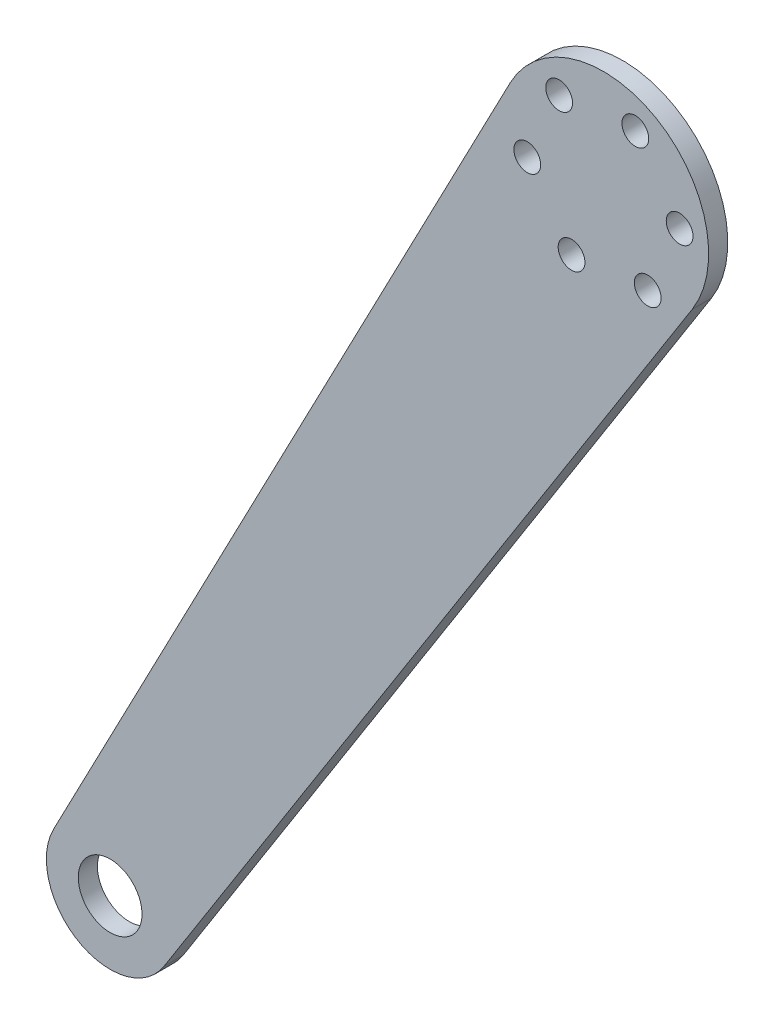
ISO-10303-21;
HEADER;
FILE_DESCRIPTION(('STEP AP214'),'2;1');
FILE_NAME('part.step','',(''),(''),'','','');
FILE_SCHEMA(('AUTOMOTIVE_DESIGN { 1 0 10303 214 1 1 1 1 }'));
ENDSEC;
DATA;
#1=APPLICATION_CONTEXT('core data for automotive mechanical design processes');
#2=APPLICATION_PROTOCOL_DEFINITION('international standard','automotive_design',2000,#1);
#3=PRODUCT_CONTEXT('',#1,'mechanical');
#4=PRODUCT('Part','Part','',(#3));
#5=PRODUCT_RELATED_PRODUCT_CATEGORY('part','',(#4));
#6=PRODUCT_DEFINITION_FORMATION('','',#4);
#7=PRODUCT_DEFINITION_CONTEXT('part definition',#1,'design');
#8=PRODUCT_DEFINITION('design','',#6,#7);
#9=PRODUCT_DEFINITION_SHAPE('','',#8);
#10=(LENGTH_UNIT() NAMED_UNIT(*) SI_UNIT(.MILLI.,.METRE.));
#11=(NAMED_UNIT(*) PLANE_ANGLE_UNIT() SI_UNIT($,.RADIAN.));
#12=(NAMED_UNIT(*) SI_UNIT($,.STERADIAN.) SOLID_ANGLE_UNIT());
#13=UNCERTAINTY_MEASURE_WITH_UNIT(LENGTH_MEASURE(1.E-05),#10,'distance_accuracy_value','');
#14=(GEOMETRIC_REPRESENTATION_CONTEXT(3) GLOBAL_UNCERTAINTY_ASSIGNED_CONTEXT((#13)) GLOBAL_UNIT_ASSIGNED_CONTEXT((#10,
#11,#12)) REPRESENTATION_CONTEXT('',''));
#15=CARTESIAN_POINT('',(0.,0.,0.));
#16=DIRECTION('',(0.,0.,1.));
#17=DIRECTION('',(1.,0.,0.));
#18=AXIS2_PLACEMENT_3D('',#15,#16,#17);
#19=CARTESIAN_POINT('',(-74.391553652002,-84.5862183341336,37.0567284098367));
#20=DIRECTION('',(0.,0.,-1.));
#21=DIRECTION('',(-1.,0.,0.));
#22=AXIS2_PLACEMENT_3D('',#19,#20,#21);
#23=PLANE('',#22);
#24=CARTESIAN_POINT('',(-2.02418145154922,38.6653338466076,37.0567284098367));
#25=DIRECTION('',(0.,0.,-1.));
#26=DIRECTION('',(-1.,0.,0.));
#27=AXIS2_PLACEMENT_3D('',#24,#25,#26);
#28=CIRCLE('',#27,2.1);
#29=CARTESIAN_POINT('',(-4.12418145154922,38.6653338466076,37.0567284098367));
#30=VERTEX_POINT('',#29);
#31=EDGE_CURVE('E148',#30,#30,#28,.T.);
#32=ORIENTED_EDGE('',*,*,#31,.F.);
#33=EDGE_LOOP('',(#32));
#34=FACE_BOUND('',#33,.T.);
#35=CARTESIAN_POINT('',(-3.96960396064169,59.3586982724383,37.0567284098367));
#36=DIRECTION('',(0.,0.,-1.));
#37=DIRECTION('',(-1.,0.,0.));
#38=AXIS2_PLACEMENT_3D('',#35,#36,#37);
#39=CIRCLE('',#38,2.1);
#40=CARTESIAN_POINT('',(-6.06960396064169,59.3586982724383,37.0567284098367));
#41=VERTEX_POINT('',#40);
#42=EDGE_CURVE('E136',#41,#41,#39,.T.);
#43=ORIENTED_EDGE('',*,*,#42,.F.);
#44=EDGE_LOOP('',(#43));
#45=FACE_BOUND('',#44,.T.);
#46=CARTESIAN_POINT('',(-74.391553652002,-84.5862183341336,37.0567284098367));
#47=DIRECTION('',(0.,0.,-1.));
#48=DIRECTION('',(-1.,0.,0.));
#49=AXIS2_PLACEMENT_3D('',#46,#47,#48);
#50=CIRCLE('',#49,5.00000000000001);
#51=CARTESIAN_POINT('',(-79.391553652002,-84.5862183341336,37.0567284098367));
#52=VERTEX_POINT('',#51);
#53=EDGE_CURVE('E124',#52,#52,#50,.T.);
#54=ORIENTED_EDGE('',*,*,#53,.F.);
#55=EDGE_LOOP('',(#54));
#56=FACE_BOUND('',#55,.T.);
#57=CARTESIAN_POINT('',(-74.391553652002,-84.5862183341336,37.0567284098367));
#58=DIRECTION('',(0.,0.,-1.));
#59=DIRECTION('',(-1.,0.,0.));
#60=AXIS2_PLACEMENT_3D('',#57,#58,#59);
#61=CIRCLE('',#60,10.);
#62=CARTESIAN_POINT('',(-65.946121215485,-89.9410919050247,37.0567284098367));
#63=VERTEX_POINT('',#62);
#64=CARTESIAN_POINT('',(-83.2563315297769,-79.9585068935064,37.0567284098367));
#65=VERTEX_POINT('',#64);
#66=EDGE_CURVE('E94',#63,#65,#61,.T.);
#67=ORIENTED_EDGE('',*,*,#66,.T.);
#68=DIRECTION('',(0.462771144062719,0.886477787777495,0.));
#69=VECTOR('',#68,1.);
#70=CARTESIAN_POINT('',(-83.2563315297769,-79.9585068935064,37.0567284098367));
#71=LINE('',#70,#69);
#72=CARTESIAN_POINT('',(-11.6501164435668,57.2093350412102,37.0567284098367));
#73=VERTEX_POINT('',#72);
#74=EDGE_CURVE('E89',#65,#73,#71,.T.);
#75=ORIENTED_EDGE('',*,*,#74,.T.);
#76=CARTESIAN_POINT('',(2.97676705476191,49.5736111641754,37.0567284098367));
#77=DIRECTION('',(0.,0.,-1.));
#78=DIRECTION('',(-1.,0.,0.));
#79=AXIS2_PLACEMENT_3D('',#76,#77,#78);
#80=CIRCLE('',#79,16.5);
#81=CARTESIAN_POINT('',(16.9117305750148,40.7380697722051,37.0567284098367));
#82=VERTEX_POINT('',#81);
#83=EDGE_CURVE('E92',#73,#82,#80,.T.);
#84=ORIENTED_EDGE('',*,*,#83,.T.);
#85=DIRECTION('',(-0.535487357089108,-0.844543243651693,0.));
#86=VECTOR('',#85,1.);
#87=CARTESIAN_POINT('',(16.9117305750148,40.7380697722051,37.0567284098367));
#88=LINE('',#87,#86);
#89=EDGE_CURVE('E59',#82,#63,#88,.T.);
#90=ORIENTED_EDGE('',*,*,#89,.T.);
#91=EDGE_LOOP('',(#67,#75,#84,#90));
#92=FACE_BOUND('',#91,.T.);
#93=CARTESIAN_POINT('',(14.924086576466,50.696801373494,37.0567284098367));
#94=DIRECTION('',(0.,0.,-1.));
#95=DIRECTION('',(-1.,0.,0.));
#96=AXIS2_PLACEMENT_3D('',#93,#94,#95);
#97=CIRCLE('',#96,2.1);
#98=CARTESIAN_POINT('',(12.824086576466,50.696801373494,37.0567284098367));
#99=VERTEX_POINT('',#98);
#100=EDGE_CURVE('E109',#99,#99,#97,.T.);
#101=ORIENTED_EDGE('',*,*,#100,.F.);
#102=EDGE_LOOP('',(#101));
#103=FACE_BOUND('',#102,.T.);
#104=CARTESIAN_POINT('',(7.97771556106237,60.4818884817569,37.0567284098367));
#105=DIRECTION('',(0.,0.,-1.));
#106=DIRECTION('',(-1.,0.,0.));
#107=AXIS2_PLACEMENT_3D('',#104,#105,#106);
#108=CIRCLE('',#107,2.1);
#109=CARTESIAN_POINT('',(5.87771556106237,60.4818884817569,37.0567284098367));
#110=VERTEX_POINT('',#109);
#111=EDGE_CURVE('E130',#110,#110,#108,.T.);
#112=ORIENTED_EDGE('',*,*,#111,.F.);
#113=EDGE_LOOP('',(#112));
#114=FACE_BOUND('',#113,.T.);
#115=CARTESIAN_POINT('',(-8.97055246695019,48.4504209548757,37.0567284098367));
#116=DIRECTION('',(0.,0.,-1.));
#117=DIRECTION('',(-1.,0.,0.));
#118=AXIS2_PLACEMENT_3D('',#115,#116,#117);
#119=CIRCLE('',#118,2.1);
#120=CARTESIAN_POINT('',(-11.0705524669502,48.4504209548757,37.0567284098367));
#121=VERTEX_POINT('',#120);
#122=EDGE_CURVE('E142',#121,#121,#119,.T.);
#123=ORIENTED_EDGE('',*,*,#122,.F.);
#124=EDGE_LOOP('',(#123));
#125=FACE_BOUND('',#124,.T.);
#126=CARTESIAN_POINT('',(9.92313807016551,39.7885240559125,37.0567284098367));
#127=DIRECTION('',(0.,0.,-1.));
#128=DIRECTION('',(-1.,0.,0.));
#129=AXIS2_PLACEMENT_3D('',#126,#127,#128);
#130=CIRCLE('',#129,2.1);
#131=CARTESIAN_POINT('',(7.82313807016552,39.7885240559125,37.0567284098367));
#132=VERTEX_POINT('',#131);
#133=EDGE_CURVE('E154',#132,#132,#130,.T.);
#134=ORIENTED_EDGE('',*,*,#133,.F.);
#135=EDGE_LOOP('',(#134));
#136=FACE_BOUND('',#135,.T.);
#137=ADVANCED_FACE('F42',(#34,#45,#56,#92,#103,#114,#125,#136),#23,.T.);
#138=CARTESIAN_POINT('',(-74.391553652002,-84.5862183341336,40.0567284098367));
#139=DIRECTION('',(0.,0.,-1.));
#140=DIRECTION('',(-1.,0.,0.));
#141=AXIS2_PLACEMENT_3D('',#138,#139,#140);
#142=PLANE('',#141);
#143=CARTESIAN_POINT('',(-74.391553652002,-84.5862183341336,40.0567284098367));
#144=DIRECTION('',(0.,0.,-1.));
#145=DIRECTION('',(-1.,0.,0.));
#146=AXIS2_PLACEMENT_3D('',#143,#144,#145);
#147=CIRCLE('',#146,10.);
#148=CARTESIAN_POINT('',(-65.946121215485,-89.9410919050247,40.0567284098367));
#149=VERTEX_POINT('',#148);
#150=CARTESIAN_POINT('',(-83.2563315297769,-79.9585068935064,40.0567284098367));
#151=VERTEX_POINT('',#150);
#152=EDGE_CURVE('E106',#149,#151,#147,.T.);
#153=ORIENTED_EDGE('',*,*,#152,.F.);
#154=DIRECTION('',(-0.535487357089108,-0.844543243651693,0.));
#155=VECTOR('',#154,1.);
#156=CARTESIAN_POINT('',(16.9117305750148,40.7380697722051,40.0567284098367));
#157=LINE('',#156,#155);
#158=CARTESIAN_POINT('',(16.9117305750148,40.7380697722051,40.0567284098367));
#159=VERTEX_POINT('',#158);
#160=EDGE_CURVE('E82',#159,#149,#157,.T.);
#161=ORIENTED_EDGE('',*,*,#160,.F.);
#162=CARTESIAN_POINT('',(2.97676705476191,49.5736111641754,40.0567284098367));
#163=DIRECTION('',(0.,0.,-1.));
#164=DIRECTION('',(-1.,0.,0.));
#165=AXIS2_PLACEMENT_3D('',#162,#163,#164);
#166=CIRCLE('',#165,16.5);
#167=CARTESIAN_POINT('',(-11.6501164435668,57.2093350412102,40.0567284098367));
#168=VERTEX_POINT('',#167);
#169=EDGE_CURVE('E76',#168,#159,#166,.T.);
#170=ORIENTED_EDGE('',*,*,#169,.F.);
#171=DIRECTION('',(0.462771144062719,0.886477787777495,0.));
#172=VECTOR('',#171,1.);
#173=CARTESIAN_POINT('',(-83.2563315297769,-79.9585068935064,40.0567284098367));
#174=LINE('',#173,#172);
#175=EDGE_CURVE('E98',#151,#168,#174,.T.);
#176=ORIENTED_EDGE('',*,*,#175,.F.);
#177=EDGE_LOOP('',(#153,#161,#170,#176));
#178=FACE_BOUND('',#177,.T.);
#179=CARTESIAN_POINT('',(14.924086576466,50.696801373494,40.0567284098367));
#180=DIRECTION('',(0.,0.,-1.));
#181=DIRECTION('',(-1.,0.,0.));
#182=AXIS2_PLACEMENT_3D('',#179,#180,#181);
#183=CIRCLE('',#182,2.1);
#184=CARTESIAN_POINT('',(12.824086576466,50.696801373494,40.0567284098367));
#185=VERTEX_POINT('',#184);
#186=EDGE_CURVE('E121',#185,#185,#183,.T.);
#187=ORIENTED_EDGE('',*,*,#186,.T.);
#188=EDGE_LOOP('',(#187));
#189=FACE_BOUND('',#188,.T.);
#190=CARTESIAN_POINT('',(-74.391553652002,-84.5862183341336,40.0567284098367));
#191=DIRECTION('',(0.,0.,-1.));
#192=DIRECTION('',(-1.,0.,0.));
#193=AXIS2_PLACEMENT_3D('',#190,#191,#192);
#194=CIRCLE('',#193,5.00000000000001);
#195=CARTESIAN_POINT('',(-79.391553652002,-84.5862183341336,40.0567284098367));
#196=VERTEX_POINT('',#195);
#197=EDGE_CURVE('E127',#196,#196,#194,.T.);
#198=ORIENTED_EDGE('',*,*,#197,.T.);
#199=EDGE_LOOP('',(#198));
#200=FACE_BOUND('',#199,.T.);
#201=CARTESIAN_POINT('',(7.97771556106237,60.4818884817569,40.0567284098367));
#202=DIRECTION('',(0.,0.,-1.));
#203=DIRECTION('',(-1.,0.,0.));
#204=AXIS2_PLACEMENT_3D('',#201,#202,#203);
#205=CIRCLE('',#204,2.1);
#206=CARTESIAN_POINT('',(5.87771556106237,60.4818884817569,40.0567284098367));
#207=VERTEX_POINT('',#206);
#208=EDGE_CURVE('E133',#207,#207,#205,.T.);
#209=ORIENTED_EDGE('',*,*,#208,.T.);
#210=EDGE_LOOP('',(#209));
#211=FACE_BOUND('',#210,.T.);
#212=CARTESIAN_POINT('',(-3.96960396064169,59.3586982724383,40.0567284098367));
#213=DIRECTION('',(0.,0.,-1.));
#214=DIRECTION('',(-1.,0.,0.));
#215=AXIS2_PLACEMENT_3D('',#212,#213,#214);
#216=CIRCLE('',#215,2.1);
#217=CARTESIAN_POINT('',(-6.06960396064169,59.3586982724383,40.0567284098367));
#218=VERTEX_POINT('',#217);
#219=EDGE_CURVE('E139',#218,#218,#216,.T.);
#220=ORIENTED_EDGE('',*,*,#219,.T.);
#221=EDGE_LOOP('',(#220));
#222=FACE_BOUND('',#221,.T.);
#223=CARTESIAN_POINT('',(-8.97055246695019,48.4504209548757,40.0567284098367));
#224=DIRECTION('',(0.,0.,-1.));
#225=DIRECTION('',(-1.,0.,0.));
#226=AXIS2_PLACEMENT_3D('',#223,#224,#225);
#227=CIRCLE('',#226,2.1);
#228=CARTESIAN_POINT('',(-11.0705524669502,48.4504209548757,40.0567284098367));
#229=VERTEX_POINT('',#228);
#230=EDGE_CURVE('E145',#229,#229,#227,.T.);
#231=ORIENTED_EDGE('',*,*,#230,.T.);
#232=EDGE_LOOP('',(#231));
#233=FACE_BOUND('',#232,.T.);
#234=CARTESIAN_POINT('',(-2.02418145154922,38.6653338466076,40.0567284098367));
#235=DIRECTION('',(0.,0.,-1.));
#236=DIRECTION('',(-1.,0.,0.));
#237=AXIS2_PLACEMENT_3D('',#234,#235,#236);
#238=CIRCLE('',#237,2.1);
#239=CARTESIAN_POINT('',(-4.12418145154922,38.6653338466076,40.0567284098367));
#240=VERTEX_POINT('',#239);
#241=EDGE_CURVE('E151',#240,#240,#238,.T.);
#242=ORIENTED_EDGE('',*,*,#241,.T.);
#243=EDGE_LOOP('',(#242));
#244=FACE_BOUND('',#243,.T.);
#245=CARTESIAN_POINT('',(9.92313807016551,39.7885240559125,40.0567284098367));
#246=DIRECTION('',(0.,0.,-1.));
#247=DIRECTION('',(-1.,0.,0.));
#248=AXIS2_PLACEMENT_3D('',#245,#246,#247);
#249=CIRCLE('',#248,2.1);
#250=CARTESIAN_POINT('',(7.82313807016552,39.7885240559125,40.0567284098367));
#251=VERTEX_POINT('',#250);
#252=EDGE_CURVE('E157',#251,#251,#249,.T.);
#253=ORIENTED_EDGE('',*,*,#252,.T.);
#254=EDGE_LOOP('',(#253));
#255=FACE_BOUND('',#254,.T.);
#256=ADVANCED_FACE('F117',(#178,#189,#200,#211,#222,#233,#244,#255),#142,.F.);
#257=CARTESIAN_POINT('',(-74.391553652002,-84.5862183341336,37.0567284098367));
#258=DIRECTION('',(0.,0.,1.));
#259=DIRECTION('',(1.,0.,0.));
#260=AXIS2_PLACEMENT_3D('',#257,#258,#259);
#261=CYLINDRICAL_SURFACE('',#260,10.);
#262=ORIENTED_EDGE('',*,*,#152,.T.);
#263=DIRECTION('',(0.,0.,1.));
#264=VECTOR('',#263,1.);
#265=CARTESIAN_POINT('',(-83.2563315297769,-79.9585068935064,37.0567284098367));
#266=LINE('',#265,#264);
#267=EDGE_CURVE('E11',#65,#151,#266,.T.);
#268=ORIENTED_EDGE('',*,*,#267,.F.);
#269=ORIENTED_EDGE('',*,*,#66,.F.);
#270=DIRECTION('',(0.,0.,1.));
#271=VECTOR('',#270,1.);
#272=CARTESIAN_POINT('',(-65.946121215485,-89.9410919050247,37.0567284098367));
#273=LINE('',#272,#271);
#274=EDGE_CURVE('E102',#63,#149,#273,.T.);
#275=ORIENTED_EDGE('',*,*,#274,.T.);
#276=EDGE_LOOP('',(#262,#268,#269,#275));
#277=FACE_BOUND('',#276,.T.);
#278=ADVANCED_FACE('F44',(#277),#261,.T.);
#279=CARTESIAN_POINT('',(-83.2563315297769,-79.9585068935064,37.0567284098367));
#280=DIRECTION('',(0.886477787777495,-0.462771144062719,0.));
#281=DIRECTION('',(0.46277114406272,0.886477787777495,0.));
#282=AXIS2_PLACEMENT_3D('',#279,#280,#281);
#283=PLANE('',#282);
#284=ORIENTED_EDGE('',*,*,#175,.T.);
#285=DIRECTION('',(0.,0.,1.));
#286=VECTOR('',#285,1.);
#287=CARTESIAN_POINT('',(-11.6501164435668,57.2093350412102,37.0567284098367));
#288=LINE('',#287,#286);
#289=EDGE_CURVE('E51',#73,#168,#288,.T.);
#290=ORIENTED_EDGE('',*,*,#289,.F.);
#291=ORIENTED_EDGE('',*,*,#74,.F.);
#292=ORIENTED_EDGE('',*,*,#267,.T.);
#293=EDGE_LOOP('',(#284,#290,#291,#292));
#294=FACE_BOUND('',#293,.T.);
#295=ADVANCED_FACE('F97',(#294),#283,.F.);
#296=CARTESIAN_POINT('',(2.97676705476191,49.5736111641754,37.0567284098367));
#297=DIRECTION('',(0.,0.,1.));
#298=DIRECTION('',(1.,0.,0.));
#299=AXIS2_PLACEMENT_3D('',#296,#297,#298);
#300=CYLINDRICAL_SURFACE('',#299,16.5);
#301=ORIENTED_EDGE('',*,*,#169,.T.);
#302=DIRECTION('',(0.,0.,1.));
#303=VECTOR('',#302,1.);
#304=CARTESIAN_POINT('',(16.9117305750148,40.7380697722051,37.0567284098367));
#305=LINE('',#304,#303);
#306=EDGE_CURVE('E99',#82,#159,#305,.T.);
#307=ORIENTED_EDGE('',*,*,#306,.F.);
#308=ORIENTED_EDGE('',*,*,#83,.F.);
#309=ORIENTED_EDGE('',*,*,#289,.T.);
#310=EDGE_LOOP('',(#301,#307,#308,#309));
#311=FACE_BOUND('',#310,.T.);
#312=ADVANCED_FACE('F100',(#311),#300,.T.);
#313=CARTESIAN_POINT('',(16.9117305750148,40.7380697722051,37.0567284098367));
#314=DIRECTION('',(-0.844543243651693,0.535487357089108,0.));
#315=DIRECTION('',(-0.535487357089108,-0.844543243651693,0.));
#316=AXIS2_PLACEMENT_3D('',#313,#314,#315);
#317=PLANE('',#316);
#318=ORIENTED_EDGE('',*,*,#160,.T.);
#319=ORIENTED_EDGE('',*,*,#274,.F.);
#320=ORIENTED_EDGE('',*,*,#89,.F.);
#321=ORIENTED_EDGE('',*,*,#306,.T.);
#322=EDGE_LOOP('',(#318,#319,#320,#321));
#323=FACE_BOUND('',#322,.T.);
#324=ADVANCED_FACE('F114',(#323),#317,.F.);
#325=CARTESIAN_POINT('',(14.924086576466,50.696801373494,37.0567284098367));
#326=DIRECTION('',(0.,0.,1.));
#327=DIRECTION('',(1.,0.,0.));
#328=AXIS2_PLACEMENT_3D('',#325,#326,#327);
#329=CYLINDRICAL_SURFACE('',#328,2.1);
#330=ORIENTED_EDGE('',*,*,#100,.T.);
#331=EDGE_LOOP('',(#330));
#332=FACE_BOUND('',#331,.T.);
#333=ORIENTED_EDGE('',*,*,#186,.F.);
#334=EDGE_LOOP('',(#333));
#335=FACE_BOUND('',#334,.T.);
#336=ADVANCED_FACE('F176',(#332,#335),#329,.F.);
#337=CARTESIAN_POINT('',(-74.391553652002,-84.5862183341336,37.0567284098367));
#338=DIRECTION('',(0.,0.,1.));
#339=DIRECTION('',(1.,0.,0.));
#340=AXIS2_PLACEMENT_3D('',#337,#338,#339);
#341=CYLINDRICAL_SURFACE('',#340,5.00000000000001);
#342=ORIENTED_EDGE('',*,*,#53,.T.);
#343=EDGE_LOOP('',(#342));
#344=FACE_BOUND('',#343,.T.);
#345=ORIENTED_EDGE('',*,*,#197,.F.);
#346=EDGE_LOOP('',(#345));
#347=FACE_BOUND('',#346,.T.);
#348=ADVANCED_FACE('F205',(#344,#347),#341,.F.);
#349=CARTESIAN_POINT('',(7.97771556106237,60.4818884817569,37.0567284098367));
#350=DIRECTION('',(0.,0.,1.));
#351=DIRECTION('',(1.,0.,0.));
#352=AXIS2_PLACEMENT_3D('',#349,#350,#351);
#353=CYLINDRICAL_SURFACE('',#352,2.1);
#354=ORIENTED_EDGE('',*,*,#111,.T.);
#355=EDGE_LOOP('',(#354));
#356=FACE_BOUND('',#355,.T.);
#357=ORIENTED_EDGE('',*,*,#208,.F.);
#358=EDGE_LOOP('',(#357));
#359=FACE_BOUND('',#358,.T.);
#360=ADVANCED_FACE('F226',(#356,#359),#353,.F.);
#361=CARTESIAN_POINT('',(-3.96960396064169,59.3586982724383,37.0567284098367));
#362=DIRECTION('',(0.,0.,1.));
#363=DIRECTION('',(1.,0.,0.));
#364=AXIS2_PLACEMENT_3D('',#361,#362,#363);
#365=CYLINDRICAL_SURFACE('',#364,2.1);
#366=ORIENTED_EDGE('',*,*,#42,.T.);
#367=EDGE_LOOP('',(#366));
#368=FACE_BOUND('',#367,.T.);
#369=ORIENTED_EDGE('',*,*,#219,.F.);
#370=EDGE_LOOP('',(#369));
#371=FACE_BOUND('',#370,.T.);
#372=ADVANCED_FACE('F230',(#368,#371),#365,.F.);
#373=CARTESIAN_POINT('',(-8.97055246695019,48.4504209548757,37.0567284098367));
#374=DIRECTION('',(0.,0.,1.));
#375=DIRECTION('',(1.,0.,0.));
#376=AXIS2_PLACEMENT_3D('',#373,#374,#375);
#377=CYLINDRICAL_SURFACE('',#376,2.1);
#378=ORIENTED_EDGE('',*,*,#122,.T.);
#379=EDGE_LOOP('',(#378));
#380=FACE_BOUND('',#379,.T.);
#381=ORIENTED_EDGE('',*,*,#230,.F.);
#382=EDGE_LOOP('',(#381));
#383=FACE_BOUND('',#382,.T.);
#384=ADVANCED_FACE('F239',(#380,#383),#377,.F.);
#385=CARTESIAN_POINT('',(-2.02418145154922,38.6653338466076,37.0567284098367));
#386=DIRECTION('',(0.,0.,1.));
#387=DIRECTION('',(1.,0.,0.));
#388=AXIS2_PLACEMENT_3D('',#385,#386,#387);
#389=CYLINDRICAL_SURFACE('',#388,2.1);
#390=ORIENTED_EDGE('',*,*,#31,.T.);
#391=EDGE_LOOP('',(#390));
#392=FACE_BOUND('',#391,.T.);
#393=ORIENTED_EDGE('',*,*,#241,.F.);
#394=EDGE_LOOP('',(#393));
#395=FACE_BOUND('',#394,.T.);
#396=ADVANCED_FACE('F211',(#392,#395),#389,.F.);
#397=CARTESIAN_POINT('',(9.92313807016551,39.7885240559125,37.0567284098367));
#398=DIRECTION('',(0.,0.,1.));
#399=DIRECTION('',(1.,0.,0.));
#400=AXIS2_PLACEMENT_3D('',#397,#398,#399);
#401=CYLINDRICAL_SURFACE('',#400,2.1);
#402=ORIENTED_EDGE('',*,*,#133,.T.);
#403=EDGE_LOOP('',(#402));
#404=FACE_BOUND('',#403,.T.);
#405=ORIENTED_EDGE('',*,*,#252,.F.);
#406=EDGE_LOOP('',(#405));
#407=FACE_BOUND('',#406,.T.);
#408=ADVANCED_FACE('F163',(#404,#407),#401,.F.);
#409=CLOSED_SHELL('',(#137,#256,#278,#295,#312,#324,#336,#348,#360,#372,#384,#396,#408));
#410=MANIFOLD_SOLID_BREP('B2',#409);
#411=ADVANCED_BREP_SHAPE_REPRESENTATION('',(#18,#410),#14);
#412=SHAPE_DEFINITION_REPRESENTATION(#9,#411);
ENDSEC;
END-ISO-10303-21;
